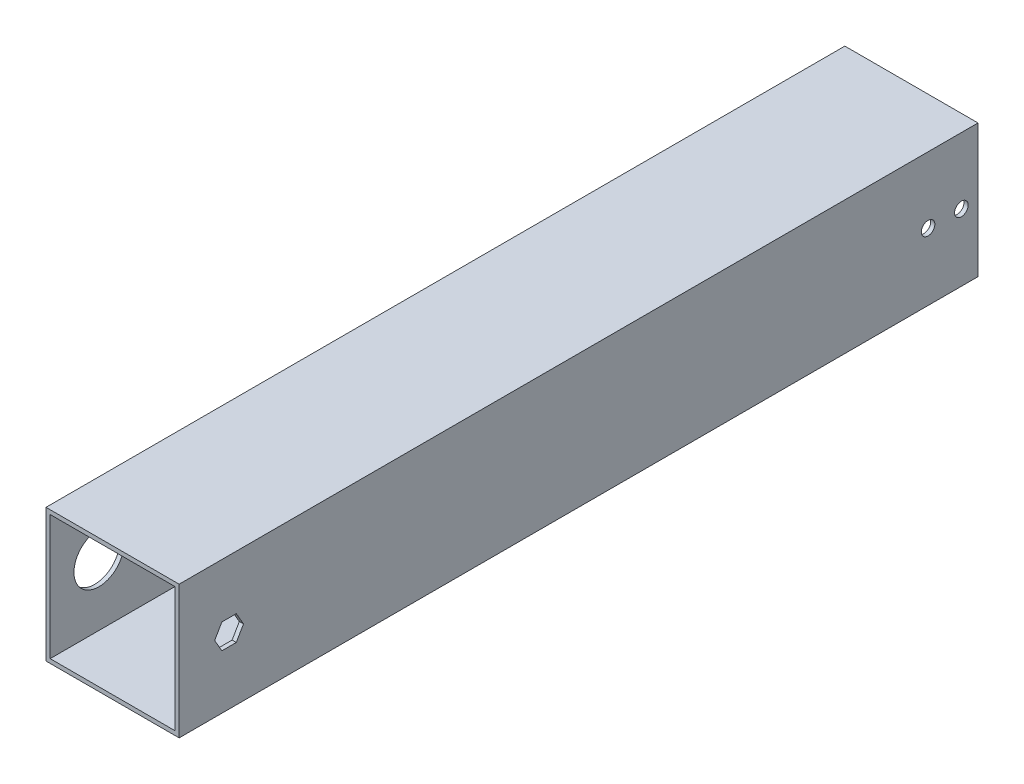
ISO-10303-21;
HEADER;
FILE_DESCRIPTION(('STEP AP214'),'2;1');
FILE_NAME('part.step','',(''),(''),'','','');
FILE_SCHEMA(('AUTOMOTIVE_DESIGN { 1 0 10303 214 1 1 1 1 }'));
ENDSEC;
DATA;
#1=APPLICATION_CONTEXT('core data for automotive mechanical design processes');
#2=APPLICATION_PROTOCOL_DEFINITION('international standard','automotive_design',2000,#1);
#3=PRODUCT_CONTEXT('',#1,'mechanical');
#4=PRODUCT('Part','Part','',(#3));
#5=PRODUCT_RELATED_PRODUCT_CATEGORY('part','',(#4));
#6=PRODUCT_DEFINITION_FORMATION('','',#4);
#7=PRODUCT_DEFINITION_CONTEXT('part definition',#1,'design');
#8=PRODUCT_DEFINITION('design','',#6,#7);
#9=PRODUCT_DEFINITION_SHAPE('','',#8);
#10=(LENGTH_UNIT() NAMED_UNIT(*) SI_UNIT(.MILLI.,.METRE.));
#11=(NAMED_UNIT(*) PLANE_ANGLE_UNIT() SI_UNIT($,.RADIAN.));
#12=(NAMED_UNIT(*) SI_UNIT($,.STERADIAN.) SOLID_ANGLE_UNIT());
#13=UNCERTAINTY_MEASURE_WITH_UNIT(LENGTH_MEASURE(1.E-05),#10,'distance_accuracy_value','');
#14=(GEOMETRIC_REPRESENTATION_CONTEXT(3) GLOBAL_UNCERTAINTY_ASSIGNED_CONTEXT((#13)) GLOBAL_UNIT_ASSIGNED_CONTEXT((#10,
#11,#12)) REPRESENTATION_CONTEXT('',''));
#15=CARTESIAN_POINT('',(0.,0.,0.));
#16=DIRECTION('',(0.,0.,1.));
#17=DIRECTION('',(1.,0.,0.));
#18=AXIS2_PLACEMENT_3D('',#15,#16,#17);
#19=CARTESIAN_POINT('',(0.,0.,304.8));
#20=DIRECTION('',(0.,0.,1.));
#21=DIRECTION('',(1.,0.,0.));
#22=AXIS2_PLACEMENT_3D('',#19,#20,#21);
#23=PLANE('',#22);
#24=DIRECTION('',(0.,-1.,0.));
#25=VECTOR('',#24,1.);
#26=CARTESIAN_POINT('',(-29.3367303609342,25.2382165605095,304.8));
#27=LINE('',#26,#25);
#28=CARTESIAN_POINT('',(-29.3367303609342,25.2382165605095,304.8));
#29=VERTEX_POINT('',#28);
#30=CARTESIAN_POINT('',(-29.3367303609342,-25.5617834394905,304.8));
#31=VERTEX_POINT('',#30);
#32=EDGE_CURVE('E235',#29,#31,#27,.T.);
#33=ORIENTED_EDGE('',*,*,#32,.T.);
#34=DIRECTION('',(1.,0.,0.));
#35=VECTOR('',#34,1.);
#36=CARTESIAN_POINT('',(-29.3367303609342,-25.5617834394905,304.8));
#37=LINE('',#36,#35);
#38=CARTESIAN_POINT('',(21.4632696390658,-25.5617834394905,304.8));
#39=VERTEX_POINT('',#38);
#40=EDGE_CURVE('E239',#31,#39,#37,.T.);
#41=ORIENTED_EDGE('',*,*,#40,.T.);
#42=DIRECTION('',(0.,1.,0.));
#43=VECTOR('',#42,1.);
#44=CARTESIAN_POINT('',(21.4632696390658,25.2382165605095,304.8));
#45=LINE('',#44,#43);
#46=CARTESIAN_POINT('',(21.4632696390658,25.2382165605095,304.8));
#47=VERTEX_POINT('',#46);
#48=EDGE_CURVE('E243',#39,#47,#45,.T.);
#49=ORIENTED_EDGE('',*,*,#48,.T.);
#50=DIRECTION('',(-1.,0.,0.));
#51=VECTOR('',#50,1.);
#52=CARTESIAN_POINT('',(-29.3367303609342,25.2382165605095,304.8));
#53=LINE('',#52,#51);
#54=EDGE_CURVE('E246',#47,#29,#53,.T.);
#55=ORIENTED_EDGE('',*,*,#54,.T.);
#56=EDGE_LOOP('',(#33,#41,#49,#55));
#57=FACE_BOUND('',#56,.T.);
#58=DIRECTION('',(1.,0.,0.));
#59=VECTOR('',#58,1.);
#60=CARTESIAN_POINT('',(-27.7492303609342,-23.9742834394905,304.8));
#61=LINE('',#60,#59);
#62=CARTESIAN_POINT('',(-27.7492303609342,-23.9742834394905,304.8));
#63=VERTEX_POINT('',#62);
#64=CARTESIAN_POINT('',(19.8757696390658,-23.9742834394905,304.8));
#65=VERTEX_POINT('',#64);
#66=EDGE_CURVE('E195',#63,#65,#61,.T.);
#67=ORIENTED_EDGE('',*,*,#66,.F.);
#68=DIRECTION('',(0.,-1.,0.));
#69=VECTOR('',#68,1.);
#70=CARTESIAN_POINT('',(-27.7492303609342,23.6507165605095,304.8));
#71=LINE('',#70,#69);
#72=CARTESIAN_POINT('',(-27.7492303609342,23.6507165605095,304.8));
#73=VERTEX_POINT('',#72);
#74=EDGE_CURVE('E192',#73,#63,#71,.T.);
#75=ORIENTED_EDGE('',*,*,#74,.F.);
#76=DIRECTION('',(-1.,0.,0.));
#77=VECTOR('',#76,1.);
#78=CARTESIAN_POINT('',(-27.7492303609342,23.6507165605095,304.8));
#79=LINE('',#78,#77);
#80=CARTESIAN_POINT('',(19.8757696390658,23.6507165605095,304.8));
#81=VERTEX_POINT('',#80);
#82=EDGE_CURVE('E203',#81,#73,#79,.T.);
#83=ORIENTED_EDGE('',*,*,#82,.F.);
#84=DIRECTION('',(0.,1.,0.));
#85=VECTOR('',#84,1.);
#86=CARTESIAN_POINT('',(19.8757696390658,23.6507165605095,304.8));
#87=LINE('',#86,#85);
#88=EDGE_CURVE('E199',#65,#81,#87,.T.);
#89=ORIENTED_EDGE('',*,*,#88,.F.);
#90=EDGE_LOOP('',(#67,#75,#83,#89));
#91=FACE_BOUND('',#90,.T.);
#92=ADVANCED_FACE('F38',(#57,#91),#23,.T.);
#93=CARTESIAN_POINT('',(0.,0.,0.));
#94=DIRECTION('',(0.,0.,1.));
#95=DIRECTION('',(1.,0.,0.));
#96=AXIS2_PLACEMENT_3D('',#93,#94,#95);
#97=PLANE('',#96);
#98=DIRECTION('',(0.,-1.,0.));
#99=VECTOR('',#98,1.);
#100=CARTESIAN_POINT('',(-29.3367303609342,25.2382165605095,0.));
#101=LINE('',#100,#99);
#102=CARTESIAN_POINT('',(-29.3367303609342,25.2382165605095,0.));
#103=VERTEX_POINT('',#102);
#104=CARTESIAN_POINT('',(-29.3367303609342,-25.5617834394905,0.));
#105=VERTEX_POINT('',#104);
#106=EDGE_CURVE('E234',#103,#105,#101,.T.);
#107=ORIENTED_EDGE('',*,*,#106,.F.);
#108=DIRECTION('',(-1.,0.,0.));
#109=VECTOR('',#108,1.);
#110=CARTESIAN_POINT('',(-29.3367303609342,25.2382165605095,0.));
#111=LINE('',#110,#109);
#112=CARTESIAN_POINT('',(21.4632696390658,25.2382165605095,0.));
#113=VERTEX_POINT('',#112);
#114=EDGE_CURVE('E240',#113,#103,#111,.T.);
#115=ORIENTED_EDGE('',*,*,#114,.F.);
#116=DIRECTION('',(0.,1.,0.));
#117=VECTOR('',#116,1.);
#118=CARTESIAN_POINT('',(21.4632696390658,25.2382165605095,0.));
#119=LINE('',#118,#117);
#120=CARTESIAN_POINT('',(21.4632696390658,-25.5617834394905,0.));
#121=VERTEX_POINT('',#120);
#122=EDGE_CURVE('E256',#121,#113,#119,.T.);
#123=ORIENTED_EDGE('',*,*,#122,.F.);
#124=DIRECTION('',(1.,0.,0.));
#125=VECTOR('',#124,1.);
#126=CARTESIAN_POINT('',(-29.3367303609342,-25.5617834394905,0.));
#127=LINE('',#126,#125);
#128=EDGE_CURVE('E253',#105,#121,#127,.T.);
#129=ORIENTED_EDGE('',*,*,#128,.F.);
#130=EDGE_LOOP('',(#107,#115,#123,#129));
#131=FACE_BOUND('',#130,.T.);
#132=DIRECTION('',(0.,-1.,0.));
#133=VECTOR('',#132,1.);
#134=CARTESIAN_POINT('',(-27.7492303609342,23.6507165605095,0.));
#135=LINE('',#134,#133);
#136=CARTESIAN_POINT('',(-27.7492303609342,23.6507165605095,0.));
#137=VERTEX_POINT('',#136);
#138=CARTESIAN_POINT('',(-27.7492303609342,-23.9742834394905,0.));
#139=VERTEX_POINT('',#138);
#140=EDGE_CURVE('E181',#137,#139,#135,.T.);
#141=ORIENTED_EDGE('',*,*,#140,.T.);
#142=DIRECTION('',(1.,0.,0.));
#143=VECTOR('',#142,1.);
#144=CARTESIAN_POINT('',(-27.7492303609342,-23.9742834394905,0.));
#145=LINE('',#144,#143);
#146=CARTESIAN_POINT('',(19.8757696390658,-23.9742834394905,0.));
#147=VERTEX_POINT('',#146);
#148=EDGE_CURVE('E210',#139,#147,#145,.T.);
#149=ORIENTED_EDGE('',*,*,#148,.T.);
#150=DIRECTION('',(0.,1.,0.));
#151=VECTOR('',#150,1.);
#152=CARTESIAN_POINT('',(19.8757696390658,23.6507165605095,0.));
#153=LINE('',#152,#151);
#154=CARTESIAN_POINT('',(19.8757696390658,23.6507165605095,0.));
#155=VERTEX_POINT('',#154);
#156=EDGE_CURVE('E214',#147,#155,#153,.T.);
#157=ORIENTED_EDGE('',*,*,#156,.T.);
#158=DIRECTION('',(-1.,0.,0.));
#159=VECTOR('',#158,1.);
#160=CARTESIAN_POINT('',(-27.7492303609342,23.6507165605095,0.));
#161=LINE('',#160,#159);
#162=EDGE_CURVE('E196',#155,#137,#161,.T.);
#163=ORIENTED_EDGE('',*,*,#162,.T.);
#164=EDGE_LOOP('',(#141,#149,#157,#163));
#165=FACE_BOUND('',#164,.T.);
#166=ADVANCED_FACE('F339',(#131,#165),#97,.F.);
#167=CARTESIAN_POINT('',(-29.3367303609342,25.2382165605095,304.8));
#168=DIRECTION('',(1.,0.,0.));
#169=DIRECTION('',(0.,1.,0.));
#170=AXIS2_PLACEMENT_3D('',#167,#168,#169);
#171=PLANE('',#170);
#172=CARTESIAN_POINT('',(-29.3367303609342,0.,286.190661960688));
#173=DIRECTION('',(-1.,0.,0.));
#174=DIRECTION('',(0.,-1.,0.));
#175=AXIS2_PLACEMENT_3D('',#172,#173,#174);
#176=CIRCLE('',#175,9.52500000000002);
#177=CARTESIAN_POINT('',(-29.3367303609342,-9.52500000000002,286.190661960688));
#178=VERTEX_POINT('',#177);
#179=EDGE_CURVE('E438',#178,#178,#176,.T.);
#180=ORIENTED_EDGE('',*,*,#179,.F.);
#181=EDGE_LOOP('',(#180));
#182=FACE_BOUND('',#181,.T.);
#183=CARTESIAN_POINT('',(-29.3367303609342,0.,6.35));
#184=DIRECTION('',(1.,0.,0.));
#185=DIRECTION('',(0.,1.,0.));
#186=AXIS2_PLACEMENT_3D('',#183,#184,#185);
#187=CIRCLE('',#186,2.5796875);
#188=CARTESIAN_POINT('',(-29.3367303609342,2.5796875,6.35));
#189=VERTEX_POINT('',#188);
#190=EDGE_CURVE('E304',#189,#189,#187,.T.);
#191=ORIENTED_EDGE('',*,*,#190,.T.);
#192=EDGE_LOOP('',(#191));
#193=FACE_BOUND('',#192,.T.);
#194=CARTESIAN_POINT('',(-29.3367303609342,0.,19.05));
#195=DIRECTION('',(1.,0.,0.));
#196=DIRECTION('',(0.,1.,0.));
#197=AXIS2_PLACEMENT_3D('',#194,#195,#196);
#198=CIRCLE('',#197,2.5796875);
#199=CARTESIAN_POINT('',(-29.3367303609342,2.5796875,19.05));
#200=VERTEX_POINT('',#199);
#201=EDGE_CURVE('E298',#200,#200,#198,.T.);
#202=ORIENTED_EDGE('',*,*,#201,.T.);
#203=EDGE_LOOP('',(#202));
#204=FACE_BOUND('',#203,.T.);
#205=ORIENTED_EDGE('',*,*,#106,.T.);
#206=DIRECTION('',(0.,0.,-1.));
#207=VECTOR('',#206,1.);
#208=CARTESIAN_POINT('',(-29.3367303609342,-25.5617834394905,304.8));
#209=LINE('',#208,#207);
#210=EDGE_CURVE('E272',#31,#105,#209,.T.);
#211=ORIENTED_EDGE('',*,*,#210,.F.);
#212=ORIENTED_EDGE('',*,*,#32,.F.);
#213=DIRECTION('',(0.,0.,-1.));
#214=VECTOR('',#213,1.);
#215=CARTESIAN_POINT('',(-29.3367303609342,25.2382165605095,304.8));
#216=LINE('',#215,#214);
#217=EDGE_CURVE('E249',#29,#103,#216,.T.);
#218=ORIENTED_EDGE('',*,*,#217,.T.);
#219=EDGE_LOOP('',(#205,#211,#212,#218));
#220=FACE_BOUND('',#219,.T.);
#221=ADVANCED_FACE('F40',(#182,#193,#204,#220),#171,.F.);
#222=CARTESIAN_POINT('',(-29.3367303609342,-25.5617834394905,304.8));
#223=DIRECTION('',(0.,1.,0.));
#224=DIRECTION('',(0.,0.,1.));
#225=AXIS2_PLACEMENT_3D('',#222,#223,#224);
#226=PLANE('',#225);
#227=ORIENTED_EDGE('',*,*,#128,.T.);
#228=DIRECTION('',(0.,0.,-1.));
#229=VECTOR('',#228,1.);
#230=CARTESIAN_POINT('',(21.4632696390658,-25.5617834394905,304.8));
#231=LINE('',#230,#229);
#232=EDGE_CURVE('E268',#39,#121,#231,.T.);
#233=ORIENTED_EDGE('',*,*,#232,.F.);
#234=ORIENTED_EDGE('',*,*,#40,.F.);
#235=ORIENTED_EDGE('',*,*,#210,.T.);
#236=EDGE_LOOP('',(#227,#233,#234,#235));
#237=FACE_BOUND('',#236,.T.);
#238=ADVANCED_FACE('F357',(#237),#226,.F.);
#239=CARTESIAN_POINT('',(21.4632696390658,25.2382165605095,304.8));
#240=DIRECTION('',(-1.,0.,0.));
#241=DIRECTION('',(0.,-1.,0.));
#242=AXIS2_PLACEMENT_3D('',#239,#240,#241);
#243=PLANE('',#242);
#244=CARTESIAN_POINT('',(21.4632696390658,0.,6.35));
#245=DIRECTION('',(1.,0.,0.));
#246=DIRECTION('',(0.,1.,0.));
#247=AXIS2_PLACEMENT_3D('',#244,#245,#246);
#248=CIRCLE('',#247,2.5796875);
#249=CARTESIAN_POINT('',(21.4632696390658,2.5796875,6.35));
#250=VERTEX_POINT('',#249);
#251=EDGE_CURVE('E293',#250,#250,#248,.T.);
#252=ORIENTED_EDGE('',*,*,#251,.F.);
#253=EDGE_LOOP('',(#252));
#254=FACE_BOUND('',#253,.T.);
#255=CARTESIAN_POINT('',(21.4632696390658,0.,19.05));
#256=DIRECTION('',(1.,0.,0.));
#257=DIRECTION('',(0.,1.,0.));
#258=AXIS2_PLACEMENT_3D('',#255,#256,#257);
#259=CIRCLE('',#258,2.5796875);
#260=CARTESIAN_POINT('',(21.4632696390658,2.5796875,19.05));
#261=VERTEX_POINT('',#260);
#262=EDGE_CURVE('E430',#261,#261,#259,.T.);
#263=ORIENTED_EDGE('',*,*,#262,.F.);
#264=EDGE_LOOP('',(#263));
#265=FACE_BOUND('',#264,.T.);
#266=DIRECTION('',(0.,0.866025403784438,0.500000000000001));
#267=VECTOR('',#266,1.);
#268=CARTESIAN_POINT('',(21.4632696390658,-0.161783439490455,280.250738685969));
#269=LINE('',#268,#267);
#270=CARTESIAN_POINT('',(21.4632696390658,-0.161783439490495,280.250738685969));
#271=VERTEX_POINT('',#270);
#272=CARTESIAN_POINT('',(21.4632696390658,4.60071656050956,283.000369342984));
#273=VERTEX_POINT('',#272);
#274=EDGE_CURVE('E154',#271,#273,#269,.T.);
#275=ORIENTED_EDGE('',*,*,#274,.F.);
#276=DIRECTION('',(0.,0.866025403784438,-0.500000000000001));
#277=VECTOR('',#276,1.);
#278=CARTESIAN_POINT('',(21.4632696390658,-4.92428343949047,283.000369342984));
#279=LINE('',#278,#277);
#280=CARTESIAN_POINT('',(21.4632696390658,-4.92428343949047,283.000369342984));
#281=VERTEX_POINT('',#280);
#282=EDGE_CURVE('E56',#281,#271,#279,.T.);
#283=ORIENTED_EDGE('',*,*,#282,.F.);
#284=DIRECTION('',(0.,0.,-1.));
#285=VECTOR('',#284,1.);
#286=CARTESIAN_POINT('',(21.4632696390658,-4.92428343949047,288.499630657016));
#287=LINE('',#286,#285);
#288=CARTESIAN_POINT('',(21.4632696390658,-4.92428343949047,288.499630657016));
#289=VERTEX_POINT('',#288);
#290=EDGE_CURVE('E174',#289,#281,#287,.T.);
#291=ORIENTED_EDGE('',*,*,#290,.F.);
#292=DIRECTION('',(0.,-0.866025403784439,-0.5));
#293=VECTOR('',#292,1.);
#294=CARTESIAN_POINT('',(21.4632696390658,-0.161783439490436,291.249261314031));
#295=LINE('',#294,#293);
#296=CARTESIAN_POINT('',(21.4632696390658,-0.161783439490436,291.249261314031));
#297=VERTEX_POINT('',#296);
#298=EDGE_CURVE('E167',#297,#289,#295,.T.);
#299=ORIENTED_EDGE('',*,*,#298,.F.);
#300=DIRECTION('',(0.,-0.866025403784437,0.500000000000003));
#301=VECTOR('',#300,1.);
#302=CARTESIAN_POINT('',(21.4632696390658,4.60071656050956,288.499630657016));
#303=LINE('',#302,#301);
#304=CARTESIAN_POINT('',(21.4632696390658,4.60071656050956,288.499630657016));
#305=VERTEX_POINT('',#304);
#306=EDGE_CURVE('E163',#305,#297,#303,.T.);
#307=ORIENTED_EDGE('',*,*,#306,.F.);
#308=DIRECTION('',(0.,0.,1.));
#309=VECTOR('',#308,1.);
#310=CARTESIAN_POINT('',(21.4632696390658,4.60071656050956,283.000369342984));
#311=LINE('',#310,#309);
#312=EDGE_CURVE('E144',#273,#305,#311,.T.);
#313=ORIENTED_EDGE('',*,*,#312,.F.);
#314=EDGE_LOOP('',(#275,#283,#291,#299,#307,#313));
#315=FACE_BOUND('',#314,.T.);
#316=ORIENTED_EDGE('',*,*,#122,.T.);
#317=DIRECTION('',(0.,0.,-1.));
#318=VECTOR('',#317,1.);
#319=CARTESIAN_POINT('',(21.4632696390658,25.2382165605095,304.8));
#320=LINE('',#319,#318);
#321=EDGE_CURVE('E264',#47,#113,#320,.T.);
#322=ORIENTED_EDGE('',*,*,#321,.F.);
#323=ORIENTED_EDGE('',*,*,#48,.F.);
#324=ORIENTED_EDGE('',*,*,#232,.T.);
#325=EDGE_LOOP('',(#316,#322,#323,#324));
#326=FACE_BOUND('',#325,.T.);
#327=ADVANCED_FACE('F159',(#254,#265,#315,#326),#243,.F.);
#328=CARTESIAN_POINT('',(-29.3367303609342,25.2382165605095,304.8));
#329=DIRECTION('',(0.,-1.,0.));
#330=DIRECTION('',(0.,0.,-1.));
#331=AXIS2_PLACEMENT_3D('',#328,#329,#330);
#332=PLANE('',#331);
#333=ORIENTED_EDGE('',*,*,#114,.T.);
#334=ORIENTED_EDGE('',*,*,#217,.F.);
#335=ORIENTED_EDGE('',*,*,#54,.F.);
#336=ORIENTED_EDGE('',*,*,#321,.T.);
#337=EDGE_LOOP('',(#333,#334,#335,#336));
#338=FACE_BOUND('',#337,.T.);
#339=ADVANCED_FACE('F352',(#338),#332,.F.);
#340=CARTESIAN_POINT('',(-27.7492303609342,23.6507165605095,304.8));
#341=DIRECTION('',(1.,0.,0.));
#342=DIRECTION('',(0.,1.,0.));
#343=AXIS2_PLACEMENT_3D('',#340,#341,#342);
#344=PLANE('',#343);
#345=CARTESIAN_POINT('',(-27.7492303609342,0.,286.190661960688));
#346=DIRECTION('',(1.,0.,0.));
#347=DIRECTION('',(0.,1.,0.));
#348=AXIS2_PLACEMENT_3D('',#345,#346,#347);
#349=CIRCLE('',#348,9.52500000000002);
#350=CARTESIAN_POINT('',(-27.7492303609342,9.52500000000002,286.190661960688));
#351=VERTEX_POINT('',#350);
#352=EDGE_CURVE('E42',#351,#351,#349,.T.);
#353=ORIENTED_EDGE('',*,*,#352,.F.);
#354=EDGE_LOOP('',(#353));
#355=FACE_BOUND('',#354,.T.);
#356=CARTESIAN_POINT('',(-27.7492303609342,0.,6.35));
#357=DIRECTION('',(1.,0.,0.));
#358=DIRECTION('',(0.,1.,0.));
#359=AXIS2_PLACEMENT_3D('',#356,#357,#358);
#360=CIRCLE('',#359,2.5796875);
#361=CARTESIAN_POINT('',(-27.7492303609342,2.5796875,6.35));
#362=VERTEX_POINT('',#361);
#363=EDGE_CURVE('E297',#362,#362,#360,.T.);
#364=ORIENTED_EDGE('',*,*,#363,.F.);
#365=EDGE_LOOP('',(#364));
#366=FACE_BOUND('',#365,.T.);
#367=CARTESIAN_POINT('',(-27.7492303609342,0.,19.05));
#368=DIRECTION('',(1.,0.,0.));
#369=DIRECTION('',(0.,1.,0.));
#370=AXIS2_PLACEMENT_3D('',#367,#368,#369);
#371=CIRCLE('',#370,2.5796875);
#372=CARTESIAN_POINT('',(-27.7492303609342,2.5796875,19.05));
#373=VERTEX_POINT('',#372);
#374=EDGE_CURVE('E292',#373,#373,#371,.T.);
#375=ORIENTED_EDGE('',*,*,#374,.F.);
#376=EDGE_LOOP('',(#375));
#377=FACE_BOUND('',#376,.T.);
#378=ORIENTED_EDGE('',*,*,#140,.F.);
#379=DIRECTION('',(0.,0.,-1.));
#380=VECTOR('',#379,1.);
#381=CARTESIAN_POINT('',(-27.7492303609342,23.6507165605095,304.8));
#382=LINE('',#381,#380);
#383=EDGE_CURVE('E206',#73,#137,#382,.T.);
#384=ORIENTED_EDGE('',*,*,#383,.F.);
#385=ORIENTED_EDGE('',*,*,#74,.T.);
#386=DIRECTION('',(0.,0.,-1.));
#387=VECTOR('',#386,1.);
#388=CARTESIAN_POINT('',(-27.7492303609342,-23.9742834394905,304.8));
#389=LINE('',#388,#387);
#390=EDGE_CURVE('E230',#63,#139,#389,.T.);
#391=ORIENTED_EDGE('',*,*,#390,.T.);
#392=EDGE_LOOP('',(#378,#384,#385,#391));
#393=FACE_BOUND('',#392,.T.);
#394=ADVANCED_FACE('F349',(#355,#366,#377,#393),#344,.T.);
#395=CARTESIAN_POINT('',(-27.7492303609342,-23.9742834394905,304.8));
#396=DIRECTION('',(0.,1.,0.));
#397=DIRECTION('',(0.,0.,1.));
#398=AXIS2_PLACEMENT_3D('',#395,#396,#397);
#399=PLANE('',#398);
#400=ORIENTED_EDGE('',*,*,#148,.F.);
#401=ORIENTED_EDGE('',*,*,#390,.F.);
#402=ORIENTED_EDGE('',*,*,#66,.T.);
#403=DIRECTION('',(0.,0.,-1.));
#404=VECTOR('',#403,1.);
#405=CARTESIAN_POINT('',(19.8757696390658,-23.9742834394905,304.8));
#406=LINE('',#405,#404);
#407=EDGE_CURVE('E227',#65,#147,#406,.T.);
#408=ORIENTED_EDGE('',*,*,#407,.T.);
#409=EDGE_LOOP('',(#400,#401,#402,#408));
#410=FACE_BOUND('',#409,.T.);
#411=ADVANCED_FACE('F389',(#410),#399,.T.);
#412=CARTESIAN_POINT('',(19.8757696390658,23.6507165605095,304.8));
#413=DIRECTION('',(-1.,0.,0.));
#414=DIRECTION('',(0.,-1.,0.));
#415=AXIS2_PLACEMENT_3D('',#412,#413,#414);
#416=PLANE('',#415);
#417=CARTESIAN_POINT('',(19.8757696390658,0.,6.35));
#418=DIRECTION('',(-1.,0.,0.));
#419=DIRECTION('',(0.,-1.,0.));
#420=AXIS2_PLACEMENT_3D('',#417,#418,#419);
#421=CIRCLE('',#420,2.5796875);
#422=CARTESIAN_POINT('',(19.8757696390658,2.5796875,6.35));
#423=VERTEX_POINT('',#422);
#424=EDGE_CURVE('E294',#423,#423,#421,.T.);
#425=ORIENTED_EDGE('',*,*,#424,.F.);
#426=EDGE_LOOP('',(#425));
#427=FACE_BOUND('',#426,.T.);
#428=CARTESIAN_POINT('',(19.8757696390658,0.,19.05));
#429=DIRECTION('',(-1.,0.,0.));
#430=DIRECTION('',(0.,-1.,0.));
#431=AXIS2_PLACEMENT_3D('',#428,#429,#430);
#432=CIRCLE('',#431,2.5796875);
#433=CARTESIAN_POINT('',(19.8757696390658,2.5796875,19.05));
#434=VERTEX_POINT('',#433);
#435=EDGE_CURVE('E289',#434,#434,#432,.T.);
#436=ORIENTED_EDGE('',*,*,#435,.F.);
#437=EDGE_LOOP('',(#436));
#438=FACE_BOUND('',#437,.T.);
#439=DIRECTION('',(0.,-0.866025403784438,0.500000000000001));
#440=VECTOR('',#439,1.);
#441=CARTESIAN_POINT('',(19.8757696390658,7.0674495894627,276.076939050668));
#442=LINE('',#441,#440);
#443=CARTESIAN_POINT('',(19.8757696390657,-0.161783439490455,280.250738685969));
#444=VERTEX_POINT('',#443);
#445=CARTESIAN_POINT('',(19.8757696390657,-4.92428343949047,283.000369342984));
#446=VERTEX_POINT('',#445);
#447=EDGE_CURVE('E11',#444,#446,#442,.T.);
#448=ORIENTED_EDGE('',*,*,#447,.F.);
#449=DIRECTION('',(0.,-0.866025403784438,-0.500000000000001));
#450=VECTOR('',#449,1.);
#451=CARTESIAN_POINT('',(19.8757696390658,28.3277335315563,296.699168978285));
#452=LINE('',#451,#450);
#453=CARTESIAN_POINT('',(19.8757696390658,4.60071656050956,283.000369342984));
#454=VERTEX_POINT('',#453);
#455=EDGE_CURVE('E276',#454,#444,#452,.T.);
#456=ORIENTED_EDGE('',*,*,#455,.F.);
#457=DIRECTION('',(0.,0.,-1.));
#458=VECTOR('',#457,1.);
#459=CARTESIAN_POINT('',(19.8757696390658,4.60071656050956,304.8));
#460=LINE('',#459,#458);
#461=CARTESIAN_POINT('',(19.8757696390657,4.60071656050956,288.499630657016));
#462=VERTEX_POINT('',#461);
#463=EDGE_CURVE('E147',#462,#454,#460,.T.);
#464=ORIENTED_EDGE('',*,*,#463,.F.);
#465=DIRECTION('',(0.,0.866025403784437,-0.500000000000003));
#466=VECTOR('',#465,1.);
#467=CARTESIAN_POINT('',(19.8757696390658,11.8299495894627,284.325831021715));
#468=LINE('',#467,#466);
#469=CARTESIAN_POINT('',(19.8757696390657,-0.161783439490437,291.249261314031));
#470=VERTEX_POINT('',#469);
#471=EDGE_CURVE('E281',#470,#462,#468,.T.);
#472=ORIENTED_EDGE('',*,*,#471,.F.);
#473=DIRECTION('',(0.,0.866025403784439,0.5));
#474=VECTOR('',#473,1.);
#475=CARTESIAN_POINT('',(19.8757696390658,23.5652335315563,304.948060949332));
#476=LINE('',#475,#474);
#477=CARTESIAN_POINT('',(19.8757696390657,-4.92428343949047,288.499630657016));
#478=VERTEX_POINT('',#477);
#479=EDGE_CURVE('E284',#478,#470,#476,.T.);
#480=ORIENTED_EDGE('',*,*,#479,.F.);
#481=DIRECTION('',(0.,0.,1.));
#482=VECTOR('',#481,1.);
#483=CARTESIAN_POINT('',(19.8757696390658,-4.92428343949047,304.8));
#484=LINE('',#483,#482);
#485=EDGE_CURVE('E48',#446,#478,#484,.T.);
#486=ORIENTED_EDGE('',*,*,#485,.F.);
#487=EDGE_LOOP('',(#448,#456,#464,#472,#480,#486));
#488=FACE_BOUND('',#487,.T.);
#489=ORIENTED_EDGE('',*,*,#156,.F.);
#490=ORIENTED_EDGE('',*,*,#407,.F.);
#491=ORIENTED_EDGE('',*,*,#88,.T.);
#492=DIRECTION('',(0.,0.,-1.));
#493=VECTOR('',#492,1.);
#494=CARTESIAN_POINT('',(19.8757696390658,23.6507165605095,304.8));
#495=LINE('',#494,#493);
#496=EDGE_CURVE('E224',#81,#155,#495,.T.);
#497=ORIENTED_EDGE('',*,*,#496,.T.);
#498=EDGE_LOOP('',(#489,#490,#491,#497));
#499=FACE_BOUND('',#498,.T.);
#500=ADVANCED_FACE('F393',(#427,#438,#488,#499),#416,.T.);
#501=CARTESIAN_POINT('',(-27.7492303609342,23.6507165605095,304.8));
#502=DIRECTION('',(0.,-1.,0.));
#503=DIRECTION('',(0.,0.,-1.));
#504=AXIS2_PLACEMENT_3D('',#501,#502,#503);
#505=PLANE('',#504);
#506=ORIENTED_EDGE('',*,*,#162,.F.);
#507=ORIENTED_EDGE('',*,*,#496,.F.);
#508=ORIENTED_EDGE('',*,*,#82,.T.);
#509=ORIENTED_EDGE('',*,*,#383,.T.);
#510=EDGE_LOOP('',(#506,#507,#508,#509));
#511=FACE_BOUND('',#510,.T.);
#512=ADVANCED_FACE('F384',(#511),#505,.T.);
#513=CARTESIAN_POINT('',(-283.336730360934,-0.161783439490496,280.250738685969));
#514=DIRECTION('',(0.,0.500000000000001,-0.866025403784438));
#515=DIRECTION('',(0.,0.866025403784438,0.500000000000001));
#516=AXIS2_PLACEMENT_3D('',#513,#514,#515);
#517=PLANE('',#516);
#518=ORIENTED_EDGE('',*,*,#455,.T.);
#519=DIRECTION('',(1.,0.,0.));
#520=VECTOR('',#519,1.);
#521=CARTESIAN_POINT('',(-283.336730360934,-0.161783439490496,280.250738685969));
#522=LINE('',#521,#520);
#523=EDGE_CURVE('E151',#444,#271,#522,.T.);
#524=ORIENTED_EDGE('',*,*,#523,.T.);
#525=ORIENTED_EDGE('',*,*,#274,.T.);
#526=DIRECTION('',(1.,0.,0.));
#527=VECTOR('',#526,1.);
#528=CARTESIAN_POINT('',(-283.336730360934,4.60071656050952,283.000369342984));
#529=LINE('',#528,#527);
#530=EDGE_CURVE('E64',#454,#273,#529,.T.);
#531=ORIENTED_EDGE('',*,*,#530,.F.);
#532=EDGE_LOOP('',(#518,#524,#525,#531));
#533=FACE_BOUND('',#532,.T.);
#534=ADVANCED_FACE('F155',(#533),#517,.F.);
#535=CARTESIAN_POINT('',(-283.336730360934,4.60071656050952,283.000369342984));
#536=DIRECTION('',(0.,1.,0.));
#537=DIRECTION('',(-1.,0.,0.));
#538=AXIS2_PLACEMENT_3D('',#535,#536,#537);
#539=PLANE('',#538);
#540=ORIENTED_EDGE('',*,*,#463,.T.);
#541=ORIENTED_EDGE('',*,*,#530,.T.);
#542=ORIENTED_EDGE('',*,*,#312,.T.);
#543=DIRECTION('',(1.,0.,0.));
#544=VECTOR('',#543,1.);
#545=CARTESIAN_POINT('',(-283.336730360934,4.60071656050952,288.499630657016));
#546=LINE('',#545,#544);
#547=EDGE_CURVE('E150',#462,#305,#546,.T.);
#548=ORIENTED_EDGE('',*,*,#547,.F.);
#549=EDGE_LOOP('',(#540,#541,#542,#548));
#550=FACE_BOUND('',#549,.T.);
#551=ADVANCED_FACE('F141',(#550),#539,.F.);
#552=CARTESIAN_POINT('',(-283.336730360934,4.60071656050952,288.499630657016));
#553=DIRECTION('',(0.,0.500000000000003,0.866025403784437));
#554=DIRECTION('',(0.,-0.866025403784437,0.500000000000003));
#555=AXIS2_PLACEMENT_3D('',#552,#553,#554);
#556=PLANE('',#555);
#557=ORIENTED_EDGE('',*,*,#471,.T.);
#558=ORIENTED_EDGE('',*,*,#547,.T.);
#559=ORIENTED_EDGE('',*,*,#306,.T.);
#560=DIRECTION('',(1.,0.,0.));
#561=VECTOR('',#560,1.);
#562=CARTESIAN_POINT('',(-283.336730360934,-0.161783439490478,291.249261314031));
#563=LINE('',#562,#561);
#564=EDGE_CURVE('E185',#470,#297,#563,.T.);
#565=ORIENTED_EDGE('',*,*,#564,.F.);
#566=EDGE_LOOP('',(#557,#558,#559,#565));
#567=FACE_BOUND('',#566,.T.);
#568=ADVANCED_FACE('F412',(#567),#556,.F.);
#569=CARTESIAN_POINT('',(-283.336730360934,-0.161783439490478,291.249261314031));
#570=DIRECTION('',(0.,-0.5,0.866025403784439));
#571=DIRECTION('',(0.,-0.866025403784439,-0.5));
#572=AXIS2_PLACEMENT_3D('',#569,#570,#571);
#573=PLANE('',#572);
#574=ORIENTED_EDGE('',*,*,#479,.T.);
#575=ORIENTED_EDGE('',*,*,#564,.T.);
#576=ORIENTED_EDGE('',*,*,#298,.T.);
#577=DIRECTION('',(1.,0.,0.));
#578=VECTOR('',#577,1.);
#579=CARTESIAN_POINT('',(-283.336730360934,-4.92428343949051,288.499630657016));
#580=LINE('',#579,#578);
#581=EDGE_CURVE('E182',#478,#289,#580,.T.);
#582=ORIENTED_EDGE('',*,*,#581,.F.);
#583=EDGE_LOOP('',(#574,#575,#576,#582));
#584=FACE_BOUND('',#583,.T.);
#585=ADVANCED_FACE('F415',(#584),#573,.F.);
#586=CARTESIAN_POINT('',(-283.336730360934,-4.92428343949051,288.499630657016));
#587=DIRECTION('',(0.,-1.,0.));
#588=DIRECTION('',(0.,0.,-1.));
#589=AXIS2_PLACEMENT_3D('',#586,#587,#588);
#590=PLANE('',#589);
#591=ORIENTED_EDGE('',*,*,#485,.T.);
#592=ORIENTED_EDGE('',*,*,#581,.T.);
#593=ORIENTED_EDGE('',*,*,#290,.T.);
#594=DIRECTION('',(1.,0.,0.));
#595=VECTOR('',#594,1.);
#596=CARTESIAN_POINT('',(-283.336730360934,-4.92428343949051,283.000369342984));
#597=LINE('',#596,#595);
#598=EDGE_CURVE('E178',#446,#281,#597,.T.);
#599=ORIENTED_EDGE('',*,*,#598,.F.);
#600=EDGE_LOOP('',(#591,#592,#593,#599));
#601=FACE_BOUND('',#600,.T.);
#602=ADVANCED_FACE('F407',(#601),#590,.F.);
#603=CARTESIAN_POINT('',(-283.336730360934,-4.92428343949051,283.000369342984));
#604=DIRECTION('',(0.,-0.500000000000001,-0.866025403784438));
#605=DIRECTION('',(0.,0.866025403784438,-0.500000000000001));
#606=AXIS2_PLACEMENT_3D('',#603,#604,#605);
#607=PLANE('',#606);
#608=ORIENTED_EDGE('',*,*,#447,.T.);
#609=ORIENTED_EDGE('',*,*,#598,.T.);
#610=ORIENTED_EDGE('',*,*,#282,.T.);
#611=ORIENTED_EDGE('',*,*,#523,.F.);
#612=EDGE_LOOP('',(#608,#609,#610,#611));
#613=FACE_BOUND('',#612,.T.);
#614=ADVANCED_FACE('F404',(#613),#607,.F.);
#615=CARTESIAN_POINT('',(-137.536730360934,0.,19.05));
#616=DIRECTION('',(1.,0.,0.));
#617=DIRECTION('',(0.,1.,0.));
#618=AXIS2_PLACEMENT_3D('',#615,#616,#617);
#619=CYLINDRICAL_SURFACE('',#618,2.5796875);
#620=CARTESIAN_POINT('',(19.8757696390658,2.5796875,19.05));
#621=CARTESIAN_POINT('',(19.8923060973991,2.5796875,19.05));
#622=CARTESIAN_POINT('',(19.9088425557324,2.5796875,19.05));
#623=CARTESIAN_POINT('',(19.9419154723991,2.5796875,19.05));
#624=CARTESIAN_POINT('',(19.9584519307324,2.5796875,19.05));
#625=CARTESIAN_POINT('',(19.9915248473991,2.5796875,19.05));
#626=CARTESIAN_POINT('',(20.0080613057324,2.5796875,19.05));
#627=CARTESIAN_POINT('',(20.0411342223991,2.5796875,19.05));
#628=CARTESIAN_POINT('',(20.0576706807324,2.5796875,19.05));
#629=CARTESIAN_POINT('',(20.0907435973991,2.5796875,19.05));
#630=CARTESIAN_POINT('',(20.1072800557324,2.5796875,19.05));
#631=CARTESIAN_POINT('',(20.1403529723991,2.5796875,19.05));
#632=CARTESIAN_POINT('',(20.1568894307324,2.5796875,19.05));
#633=CARTESIAN_POINT('',(20.1899623473991,2.5796875,19.05));
#634=CARTESIAN_POINT('',(20.2064988057324,2.5796875,19.05));
#635=CARTESIAN_POINT('',(20.2395717223991,2.5796875,19.05));
#636=CARTESIAN_POINT('',(20.2561081807324,2.5796875,19.05));
#637=CARTESIAN_POINT('',(20.2891810973991,2.5796875,19.05));
#638=CARTESIAN_POINT('',(20.3057175557324,2.5796875,19.05));
#639=CARTESIAN_POINT('',(20.3387904723991,2.5796875,19.05));
#640=CARTESIAN_POINT('',(20.3553269307325,2.5796875,19.05));
#641=CARTESIAN_POINT('',(20.3883998473991,2.5796875,19.05));
#642=CARTESIAN_POINT('',(20.4049363057325,2.5796875,19.05));
#643=CARTESIAN_POINT('',(20.4380092223991,2.5796875,19.05));
#644=CARTESIAN_POINT('',(20.4545456807325,2.5796875,19.05));
#645=CARTESIAN_POINT('',(20.4876185973991,2.5796875,19.05));
#646=CARTESIAN_POINT('',(20.5041550557325,2.5796875,19.05));
#647=CARTESIAN_POINT('',(20.5372279723991,2.5796875,19.05));
#648=CARTESIAN_POINT('',(20.5537644307325,2.5796875,19.05));
#649=CARTESIAN_POINT('',(20.5868373473991,2.5796875,19.05));
#650=CARTESIAN_POINT('',(20.6033738057324,2.5796875,19.05));
#651=CARTESIAN_POINT('',(20.6364467223991,2.5796875,19.05));
#652=CARTESIAN_POINT('',(20.6529831807325,2.5796875,19.05));
#653=CARTESIAN_POINT('',(20.6860560973991,2.5796875,19.05));
#654=CARTESIAN_POINT('',(20.7025925557325,2.5796875,19.05));
#655=CARTESIAN_POINT('',(20.7356654723991,2.5796875,19.05));
#656=CARTESIAN_POINT('',(20.7522019307325,2.5796875,19.05));
#657=CARTESIAN_POINT('',(20.7852748473991,2.5796875,19.05));
#658=CARTESIAN_POINT('',(20.8018113057325,2.5796875,19.05));
#659=CARTESIAN_POINT('',(20.8348842223991,2.5796875,19.05));
#660=CARTESIAN_POINT('',(20.8514206807325,2.5796875,19.05));
#661=CARTESIAN_POINT('',(20.8844935973991,2.5796875,19.05));
#662=CARTESIAN_POINT('',(20.9010300557325,2.5796875,19.05));
#663=CARTESIAN_POINT('',(20.9341029723991,2.5796875,19.05));
#664=CARTESIAN_POINT('',(20.9506394307325,2.5796875,19.05));
#665=CARTESIAN_POINT('',(20.9837123473991,2.5796875,19.05));
#666=CARTESIAN_POINT('',(21.0002488057325,2.5796875,19.05));
#667=CARTESIAN_POINT('',(21.0333217223991,2.5796875,19.05));
#668=CARTESIAN_POINT('',(21.0498581807325,2.5796875,19.05));
#669=CARTESIAN_POINT('',(21.0829310973992,2.5796875,19.05));
#670=CARTESIAN_POINT('',(21.0994675557325,2.5796875,19.05));
#671=CARTESIAN_POINT('',(21.1325404723992,2.5796875,19.05));
#672=CARTESIAN_POINT('',(21.1490769307325,2.5796875,19.05));
#673=CARTESIAN_POINT('',(21.1821498473992,2.5796875,19.05));
#674=CARTESIAN_POINT('',(21.1986863057325,2.5796875,19.05));
#675=CARTESIAN_POINT('',(21.2317592223992,2.5796875,19.05));
#676=CARTESIAN_POINT('',(21.2482956807325,2.5796875,19.05));
#677=CARTESIAN_POINT('',(21.2813685973992,2.5796875,19.05));
#678=CARTESIAN_POINT('',(21.2979050557325,2.5796875,19.05));
#679=CARTESIAN_POINT('',(21.3309779723992,2.5796875,19.05));
#680=CARTESIAN_POINT('',(21.3475144307325,2.5796875,19.05));
#681=CARTESIAN_POINT('',(21.3805873473992,2.5796875,19.05));
#682=CARTESIAN_POINT('',(21.3971238057325,2.5796875,19.05));
#683=CARTESIAN_POINT('',(21.4301967223992,2.5796875,19.05));
#684=CARTESIAN_POINT('',(21.4467331807325,2.5796875,19.05));
#685=CARTESIAN_POINT('',(21.4632696390658,2.5796875,19.05));
#686=B_SPLINE_CURVE_WITH_KNOTS('',3,(#620,#621,#622,#623,#624,#625,#626,#627,#628,#629,#630,
#631,#632,#633,#634,#635,#636,#637,#638,#639,#640,#641,#642,#643,#644,#645,#646,#647,#648,#649,
#650,#651,#652,#653,#654,#655,#656,#657,#658,#659,#660,#661,#662,#663,#664,#665,#666,#667,#668,
#669,#670,#671,#672,#673,#674,#675,#676,#677,#678,#679,#680,#681,#682,#683,#684,#685),
.UNSPECIFIED.,.F.,.F.,(4,2,2,2,2,2,2,2,2,2,2,2,2,2,2,2,2,2,2,2,2,2,2,2,2,2,2,2,2,2,2,2,4),(0.,
0.0496093750000093,0.0992187500000186,0.148828125,0.198437500000009,0.248046875000019,
0.29765625,0.347265625000009,0.396875000000019,0.446484375000028,0.496093750000037,
0.545703125000019,0.595312500000028,0.644921875000037,0.694531250000019,0.744140625000028,
0.793750000000037,0.843359375000047,0.892968750000056,0.942578125000038,0.992187500000047,
1.04179687500006,1.09140625000004,1.14101562500005,1.19062500000006,1.24023437500007,
1.28984375000007,1.33945312500006,1.38906250000007,1.43867187500007,1.48828125000006,
1.53789062500007,1.58750000000007),.UNSPECIFIED.);
#687=EDGE_CURVE('BSEAM336',#434,#261,#686,.T.);
#688=ORIENTED_EDGE('',*,*,#435,.T.);
#689=ORIENTED_EDGE('',*,*,#262,.T.);
#690=ORIENTED_EDGE('',*,*,#687,.T.);
#691=ORIENTED_EDGE('',*,*,#687,.F.);
#692=EDGE_LOOP('',(#688,#690,#689,#691));
#693=FACE_BOUND('',#692,.T.);
#694=ADVANCED_FACE('F336',(#693),#619,.F.);
#695=CARTESIAN_POINT('',(-137.536730360934,0.,6.35));
#696=DIRECTION('',(1.,0.,0.));
#697=DIRECTION('',(0.,1.,0.));
#698=AXIS2_PLACEMENT_3D('',#695,#696,#697);
#699=CYLINDRICAL_SURFACE('',#698,2.5796875);
#700=CARTESIAN_POINT('',(19.8757696390658,2.5796875,6.35));
#701=CARTESIAN_POINT('',(19.8923060973991,2.5796875,6.35));
#702=CARTESIAN_POINT('',(19.9088425557324,2.5796875,6.35));
#703=CARTESIAN_POINT('',(19.9419154723991,2.5796875,6.35));
#704=CARTESIAN_POINT('',(19.9584519307324,2.5796875,6.35));
#705=CARTESIAN_POINT('',(19.9915248473991,2.5796875,6.35));
#706=CARTESIAN_POINT('',(20.0080613057324,2.5796875,6.35));
#707=CARTESIAN_POINT('',(20.0411342223991,2.5796875,6.35));
#708=CARTESIAN_POINT('',(20.0576706807324,2.5796875,6.35));
#709=CARTESIAN_POINT('',(20.0907435973991,2.5796875,6.35));
#710=CARTESIAN_POINT('',(20.1072800557324,2.5796875,6.35));
#711=CARTESIAN_POINT('',(20.1403529723991,2.5796875,6.35));
#712=CARTESIAN_POINT('',(20.1568894307324,2.5796875,6.35));
#713=CARTESIAN_POINT('',(20.1899623473991,2.5796875,6.35));
#714=CARTESIAN_POINT('',(20.2064988057324,2.5796875,6.35));
#715=CARTESIAN_POINT('',(20.2395717223991,2.5796875,6.35));
#716=CARTESIAN_POINT('',(20.2561081807324,2.5796875,6.35));
#717=CARTESIAN_POINT('',(20.2891810973991,2.5796875,6.35));
#718=CARTESIAN_POINT('',(20.3057175557324,2.5796875,6.35));
#719=CARTESIAN_POINT('',(20.3387904723991,2.5796875,6.35));
#720=CARTESIAN_POINT('',(20.3553269307325,2.5796875,6.35));
#721=CARTESIAN_POINT('',(20.3883998473991,2.5796875,6.35));
#722=CARTESIAN_POINT('',(20.4049363057325,2.5796875,6.35));
#723=CARTESIAN_POINT('',(20.4380092223991,2.5796875,6.35));
#724=CARTESIAN_POINT('',(20.4545456807325,2.5796875,6.35));
#725=CARTESIAN_POINT('',(20.4876185973991,2.5796875,6.35));
#726=CARTESIAN_POINT('',(20.5041550557325,2.5796875,6.35));
#727=CARTESIAN_POINT('',(20.5372279723991,2.5796875,6.35));
#728=CARTESIAN_POINT('',(20.5537644307325,2.5796875,6.35));
#729=CARTESIAN_POINT('',(20.5868373473991,2.5796875,6.35));
#730=CARTESIAN_POINT('',(20.6033738057324,2.5796875,6.35));
#731=CARTESIAN_POINT('',(20.6364467223991,2.5796875,6.35));
#732=CARTESIAN_POINT('',(20.6529831807325,2.5796875,6.35));
#733=CARTESIAN_POINT('',(20.6860560973991,2.5796875,6.35));
#734=CARTESIAN_POINT('',(20.7025925557325,2.5796875,6.35));
#735=CARTESIAN_POINT('',(20.7356654723991,2.5796875,6.35));
#736=CARTESIAN_POINT('',(20.7522019307325,2.5796875,6.35));
#737=CARTESIAN_POINT('',(20.7852748473991,2.5796875,6.35));
#738=CARTESIAN_POINT('',(20.8018113057325,2.5796875,6.35));
#739=CARTESIAN_POINT('',(20.8348842223991,2.5796875,6.35));
#740=CARTESIAN_POINT('',(20.8514206807325,2.5796875,6.35));
#741=CARTESIAN_POINT('',(20.8844935973991,2.5796875,6.35));
#742=CARTESIAN_POINT('',(20.9010300557325,2.5796875,6.35));
#743=CARTESIAN_POINT('',(20.9341029723991,2.5796875,6.35));
#744=CARTESIAN_POINT('',(20.9506394307325,2.5796875,6.35));
#745=CARTESIAN_POINT('',(20.9837123473991,2.5796875,6.35));
#746=CARTESIAN_POINT('',(21.0002488057325,2.5796875,6.35));
#747=CARTESIAN_POINT('',(21.0333217223991,2.5796875,6.35));
#748=CARTESIAN_POINT('',(21.0498581807325,2.5796875,6.35));
#749=CARTESIAN_POINT('',(21.0829310973992,2.5796875,6.35));
#750=CARTESIAN_POINT('',(21.0994675557325,2.5796875,6.35));
#751=CARTESIAN_POINT('',(21.1325404723992,2.5796875,6.35));
#752=CARTESIAN_POINT('',(21.1490769307325,2.5796875,6.35));
#753=CARTESIAN_POINT('',(21.1821498473992,2.5796875,6.35));
#754=CARTESIAN_POINT('',(21.1986863057325,2.5796875,6.35));
#755=CARTESIAN_POINT('',(21.2317592223992,2.5796875,6.35));
#756=CARTESIAN_POINT('',(21.2482956807325,2.5796875,6.35));
#757=CARTESIAN_POINT('',(21.2813685973992,2.5796875,6.35));
#758=CARTESIAN_POINT('',(21.2979050557325,2.5796875,6.35));
#759=CARTESIAN_POINT('',(21.3309779723992,2.5796875,6.35));
#760=CARTESIAN_POINT('',(21.3475144307325,2.5796875,6.35));
#761=CARTESIAN_POINT('',(21.3805873473992,2.5796875,6.35));
#762=CARTESIAN_POINT('',(21.3971238057325,2.5796875,6.35));
#763=CARTESIAN_POINT('',(21.4301967223992,2.5796875,6.35));
#764=CARTESIAN_POINT('',(21.4467331807325,2.5796875,6.35));
#765=CARTESIAN_POINT('',(21.4632696390658,2.5796875,6.35));
#766=B_SPLINE_CURVE_WITH_KNOTS('',3,(#700,#701,#702,#703,#704,#705,#706,#707,#708,#709,#710,
#711,#712,#713,#714,#715,#716,#717,#718,#719,#720,#721,#722,#723,#724,#725,#726,#727,#728,#729,
#730,#731,#732,#733,#734,#735,#736,#737,#738,#739,#740,#741,#742,#743,#744,#745,#746,#747,#748,
#749,#750,#751,#752,#753,#754,#755,#756,#757,#758,#759,#760,#761,#762,#763,#764,#765),
.UNSPECIFIED.,.F.,.F.,(4,2,2,2,2,2,2,2,2,2,2,2,2,2,2,2,2,2,2,2,2,2,2,2,2,2,2,2,2,2,2,2,4),(0.,
0.0496093750000093,0.0992187500000186,0.148828125,0.198437500000009,0.248046875000019,
0.29765625,0.347265625000009,0.396875000000019,0.446484375000028,0.496093750000037,
0.545703125000019,0.595312500000028,0.644921875000037,0.694531250000019,0.744140625000028,
0.793750000000037,0.843359375000047,0.892968750000056,0.942578125000038,0.992187500000047,
1.04179687500006,1.09140625000004,1.14101562500005,1.19062500000006,1.24023437500007,
1.28984375000007,1.33945312500006,1.38906250000007,1.43867187500007,1.48828125000006,
1.53789062500007,1.58750000000007),.UNSPECIFIED.);
#767=EDGE_CURVE('BSEAM327',#423,#250,#766,.T.);
#768=ORIENTED_EDGE('',*,*,#424,.T.);
#769=ORIENTED_EDGE('',*,*,#251,.T.);
#770=ORIENTED_EDGE('',*,*,#767,.T.);
#771=ORIENTED_EDGE('',*,*,#767,.F.);
#772=EDGE_LOOP('',(#768,#770,#769,#771));
#773=FACE_BOUND('',#772,.T.);
#774=ADVANCED_FACE('F327',(#773),#699,.F.);
#775=CARTESIAN_POINT('',(-27.7492303609342,2.5796875,19.05));
#776=CARTESIAN_POINT('',(-27.7657668192675,2.5796875,19.05));
#777=CARTESIAN_POINT('',(-27.7823032776008,2.5796875,19.05));
#778=CARTESIAN_POINT('',(-27.8153761942675,2.5796875,19.05));
#779=CARTESIAN_POINT('',(-27.8319126526008,2.5796875,19.05));
#780=CARTESIAN_POINT('',(-27.8649855692675,2.5796875,19.05));
#781=CARTESIAN_POINT('',(-27.8815220276008,2.5796875,19.05));
#782=CARTESIAN_POINT('',(-27.9145949442675,2.5796875,19.05));
#783=CARTESIAN_POINT('',(-27.9311314026008,2.5796875,19.05));
#784=CARTESIAN_POINT('',(-27.9642043192675,2.5796875,19.05));
#785=CARTESIAN_POINT('',(-27.9807407776008,2.5796875,19.05));
#786=CARTESIAN_POINT('',(-28.0138136942675,2.5796875,19.05));
#787=CARTESIAN_POINT('',(-28.0303501526008,2.5796875,19.05));
#788=CARTESIAN_POINT('',(-28.0634230692675,2.5796875,19.05));
#789=CARTESIAN_POINT('',(-28.0799595276008,2.5796875,19.05));
#790=CARTESIAN_POINT('',(-28.1130324442675,2.5796875,19.05));
#791=CARTESIAN_POINT('',(-28.1295689026008,2.5796875,19.05));
#792=CARTESIAN_POINT('',(-28.1626418192675,2.5796875,19.05));
#793=CARTESIAN_POINT('',(-28.1791782776008,2.5796875,19.05));
#794=CARTESIAN_POINT('',(-28.2122511942675,2.5796875,19.05));
#795=CARTESIAN_POINT('',(-28.2287876526008,2.5796875,19.05));
#796=CARTESIAN_POINT('',(-28.2618605692675,2.5796875,19.05));
#797=CARTESIAN_POINT('',(-28.2783970276008,2.5796875,19.05));
#798=CARTESIAN_POINT('',(-28.3114699442675,2.5796875,19.05));
#799=CARTESIAN_POINT('',(-28.3280064026008,2.5796875,19.05));
#800=CARTESIAN_POINT('',(-28.3610793192675,2.5796875,19.05));
#801=CARTESIAN_POINT('',(-28.3776157776008,2.5796875,19.05));
#802=CARTESIAN_POINT('',(-28.4106886942675,2.5796875,19.05));
#803=CARTESIAN_POINT('',(-28.4272251526008,2.5796875,19.05));
#804=CARTESIAN_POINT('',(-28.4602980692675,2.5796875,19.05));
#805=CARTESIAN_POINT('',(-28.4768345276008,2.5796875,19.05));
#806=CARTESIAN_POINT('',(-28.5099074442675,2.5796875,19.05));
#807=CARTESIAN_POINT('',(-28.5264439026008,2.5796875,19.05));
#808=CARTESIAN_POINT('',(-28.5595168192675,2.5796875,19.05));
#809=CARTESIAN_POINT('',(-28.5760532776008,2.5796875,19.05));
#810=CARTESIAN_POINT('',(-28.6091261942675,2.5796875,19.05));
#811=CARTESIAN_POINT('',(-28.6256626526008,2.5796875,19.05));
#812=CARTESIAN_POINT('',(-28.6587355692675,2.5796875,19.05));
#813=CARTESIAN_POINT('',(-28.6752720276009,2.5796875,19.05));
#814=CARTESIAN_POINT('',(-28.7083449442675,2.5796875,19.05));
#815=CARTESIAN_POINT('',(-28.7248814026009,2.5796875,19.05));
#816=CARTESIAN_POINT('',(-28.7579543192675,2.5796875,19.05));
#817=CARTESIAN_POINT('',(-28.7744907776009,2.5796875,19.05));
#818=CARTESIAN_POINT('',(-28.8075636942675,2.5796875,19.05));
#819=CARTESIAN_POINT('',(-28.8241001526008,2.5796875,19.05));
#820=CARTESIAN_POINT('',(-28.8571730692675,2.5796875,19.05));
#821=CARTESIAN_POINT('',(-28.8737095276009,2.5796875,19.05));
#822=CARTESIAN_POINT('',(-28.9067824442675,2.5796875,19.05));
#823=CARTESIAN_POINT('',(-28.9233189026009,2.5796875,19.05));
#824=CARTESIAN_POINT('',(-28.9563918192675,2.5796875,19.05));
#825=CARTESIAN_POINT('',(-28.9729282776009,2.5796875,19.05));
#826=CARTESIAN_POINT('',(-29.0060011942675,2.5796875,19.05));
#827=CARTESIAN_POINT('',(-29.0225376526009,2.5796875,19.05));
#828=CARTESIAN_POINT('',(-29.0556105692675,2.5796875,19.05));
#829=CARTESIAN_POINT('',(-29.0721470276009,2.5796875,19.05));
#830=CARTESIAN_POINT('',(-29.1052199442675,2.5796875,19.05));
#831=CARTESIAN_POINT('',(-29.1217564026009,2.5796875,19.05));
#832=CARTESIAN_POINT('',(-29.1548293192675,2.5796875,19.05));
#833=CARTESIAN_POINT('',(-29.1713657776009,2.5796875,19.05));
#834=CARTESIAN_POINT('',(-29.2044386942675,2.5796875,19.05));
#835=CARTESIAN_POINT('',(-29.2209751526009,2.5796875,19.05));
#836=CARTESIAN_POINT('',(-29.2540480692675,2.5796875,19.05));
#837=CARTESIAN_POINT('',(-29.2705845276009,2.5796875,19.05));
#838=CARTESIAN_POINT('',(-29.3036574442675,2.5796875,19.05));
#839=CARTESIAN_POINT('',(-29.3201939026009,2.5796875,19.05));
#840=CARTESIAN_POINT('',(-29.3367303609342,2.5796875,19.05));
#841=B_SPLINE_CURVE_WITH_KNOTS('',3,(#775,#776,#777,#778,#779,#780,#781,#782,#783,#784,#785,
#786,#787,#788,#789,#790,#791,#792,#793,#794,#795,#796,#797,#798,#799,#800,#801,#802,#803,#804,
#805,#806,#807,#808,#809,#810,#811,#812,#813,#814,#815,#816,#817,#818,#819,#820,#821,#822,#823,
#824,#825,#826,#827,#828,#829,#830,#831,#832,#833,#834,#835,#836,#837,#838,#839,#840),
.UNSPECIFIED.,.F.,.F.,(4,2,2,2,2,2,2,2,2,2,2,2,2,2,2,2,2,2,2,2,2,2,2,2,2,2,2,2,2,2,2,2,4),(0.,
0.0496093749999954,0.0992187500000047,0.148828125,0.198437500000009,0.248046875000005,
0.29765625,0.347265625000009,0.396875000000005,0.446484375,0.49609375000001,0.545703125000005,
0.5953125,0.64492187500001,0.694531250000005,0.744140625000014,0.79375000000001,
0.843359375000005,0.892968750000014,0.94257812500001,0.992187500000019,1.04179687500001,
1.09140625000001,1.14101562500002,1.19062500000001,1.24023437500001,1.28984375000002,
1.33945312500001,1.38906250000001,1.43867187500002,1.48828125000001,1.53789062500002,
1.58750000000002),.UNSPECIFIED.);
#842=EDGE_CURVE('BSEAM324',#373,#200,#841,.T.);
#843=ORIENTED_EDGE('',*,*,#374,.T.);
#844=ORIENTED_EDGE('',*,*,#201,.F.);
#845=ORIENTED_EDGE('',*,*,#842,.T.);
#846=ORIENTED_EDGE('',*,*,#842,.F.);
#847=EDGE_LOOP('',(#843,#845,#844,#846));
#848=FACE_BOUND('',#847,.T.);
#849=ADVANCED_FACE('F324',(#848),#619,.F.);
#850=CARTESIAN_POINT('',(-27.7492303609342,2.5796875,6.35));
#851=CARTESIAN_POINT('',(-27.7657668192675,2.5796875,6.35));
#852=CARTESIAN_POINT('',(-27.7823032776008,2.5796875,6.35));
#853=CARTESIAN_POINT('',(-27.8153761942675,2.5796875,6.35));
#854=CARTESIAN_POINT('',(-27.8319126526008,2.5796875,6.35));
#855=CARTESIAN_POINT('',(-27.8649855692675,2.5796875,6.35));
#856=CARTESIAN_POINT('',(-27.8815220276008,2.5796875,6.35));
#857=CARTESIAN_POINT('',(-27.9145949442675,2.5796875,6.35));
#858=CARTESIAN_POINT('',(-27.9311314026008,2.5796875,6.35));
#859=CARTESIAN_POINT('',(-27.9642043192675,2.5796875,6.35));
#860=CARTESIAN_POINT('',(-27.9807407776008,2.5796875,6.35));
#861=CARTESIAN_POINT('',(-28.0138136942675,2.5796875,6.35));
#862=CARTESIAN_POINT('',(-28.0303501526008,2.5796875,6.35));
#863=CARTESIAN_POINT('',(-28.0634230692675,2.5796875,6.35));
#864=CARTESIAN_POINT('',(-28.0799595276008,2.5796875,6.35));
#865=CARTESIAN_POINT('',(-28.1130324442675,2.5796875,6.35));
#866=CARTESIAN_POINT('',(-28.1295689026008,2.5796875,6.35));
#867=CARTESIAN_POINT('',(-28.1626418192675,2.5796875,6.35));
#868=CARTESIAN_POINT('',(-28.1791782776008,2.5796875,6.35));
#869=CARTESIAN_POINT('',(-28.2122511942675,2.5796875,6.35));
#870=CARTESIAN_POINT('',(-28.2287876526008,2.5796875,6.35));
#871=CARTESIAN_POINT('',(-28.2618605692675,2.5796875,6.35));
#872=CARTESIAN_POINT('',(-28.2783970276008,2.5796875,6.35));
#873=CARTESIAN_POINT('',(-28.3114699442675,2.5796875,6.35));
#874=CARTESIAN_POINT('',(-28.3280064026008,2.5796875,6.35));
#875=CARTESIAN_POINT('',(-28.3610793192675,2.5796875,6.35));
#876=CARTESIAN_POINT('',(-28.3776157776008,2.5796875,6.35));
#877=CARTESIAN_POINT('',(-28.4106886942675,2.5796875,6.35));
#878=CARTESIAN_POINT('',(-28.4272251526008,2.5796875,6.35));
#879=CARTESIAN_POINT('',(-28.4602980692675,2.5796875,6.35));
#880=CARTESIAN_POINT('',(-28.4768345276008,2.5796875,6.35));
#881=CARTESIAN_POINT('',(-28.5099074442675,2.5796875,6.35));
#882=CARTESIAN_POINT('',(-28.5264439026008,2.5796875,6.35));
#883=CARTESIAN_POINT('',(-28.5595168192675,2.5796875,6.35));
#884=CARTESIAN_POINT('',(-28.5760532776008,2.5796875,6.35));
#885=CARTESIAN_POINT('',(-28.6091261942675,2.5796875,6.35));
#886=CARTESIAN_POINT('',(-28.6256626526008,2.5796875,6.35));
#887=CARTESIAN_POINT('',(-28.6587355692675,2.5796875,6.35));
#888=CARTESIAN_POINT('',(-28.6752720276009,2.5796875,6.35));
#889=CARTESIAN_POINT('',(-28.7083449442675,2.5796875,6.35));
#890=CARTESIAN_POINT('',(-28.7248814026009,2.5796875,6.35));
#891=CARTESIAN_POINT('',(-28.7579543192675,2.5796875,6.35));
#892=CARTESIAN_POINT('',(-28.7744907776009,2.5796875,6.35));
#893=CARTESIAN_POINT('',(-28.8075636942675,2.5796875,6.35));
#894=CARTESIAN_POINT('',(-28.8241001526008,2.5796875,6.35));
#895=CARTESIAN_POINT('',(-28.8571730692675,2.5796875,6.35));
#896=CARTESIAN_POINT('',(-28.8737095276009,2.5796875,6.35));
#897=CARTESIAN_POINT('',(-28.9067824442675,2.5796875,6.35));
#898=CARTESIAN_POINT('',(-28.9233189026009,2.5796875,6.35));
#899=CARTESIAN_POINT('',(-28.9563918192675,2.5796875,6.35));
#900=CARTESIAN_POINT('',(-28.9729282776009,2.5796875,6.35));
#901=CARTESIAN_POINT('',(-29.0060011942675,2.5796875,6.35));
#902=CARTESIAN_POINT('',(-29.0225376526009,2.5796875,6.35));
#903=CARTESIAN_POINT('',(-29.0556105692675,2.5796875,6.35));
#904=CARTESIAN_POINT('',(-29.0721470276009,2.5796875,6.35));
#905=CARTESIAN_POINT('',(-29.1052199442675,2.5796875,6.35));
#906=CARTESIAN_POINT('',(-29.1217564026009,2.5796875,6.35));
#907=CARTESIAN_POINT('',(-29.1548293192675,2.5796875,6.35));
#908=CARTESIAN_POINT('',(-29.1713657776009,2.5796875,6.35));
#909=CARTESIAN_POINT('',(-29.2044386942675,2.5796875,6.35));
#910=CARTESIAN_POINT('',(-29.2209751526009,2.5796875,6.35));
#911=CARTESIAN_POINT('',(-29.2540480692675,2.5796875,6.35));
#912=CARTESIAN_POINT('',(-29.2705845276009,2.5796875,6.35));
#913=CARTESIAN_POINT('',(-29.3036574442675,2.5796875,6.35));
#914=CARTESIAN_POINT('',(-29.3201939026009,2.5796875,6.35));
#915=CARTESIAN_POINT('',(-29.3367303609342,2.5796875,6.35));
#916=B_SPLINE_CURVE_WITH_KNOTS('',3,(#850,#851,#852,#853,#854,#855,#856,#857,#858,#859,#860,
#861,#862,#863,#864,#865,#866,#867,#868,#869,#870,#871,#872,#873,#874,#875,#876,#877,#878,#879,
#880,#881,#882,#883,#884,#885,#886,#887,#888,#889,#890,#891,#892,#893,#894,#895,#896,#897,#898,
#899,#900,#901,#902,#903,#904,#905,#906,#907,#908,#909,#910,#911,#912,#913,#914,#915),
.UNSPECIFIED.,.F.,.F.,(4,2,2,2,2,2,2,2,2,2,2,2,2,2,2,2,2,2,2,2,2,2,2,2,2,2,2,2,2,2,2,2,4),(0.,
0.0496093749999954,0.0992187500000047,0.148828125,0.198437500000009,0.248046875000005,
0.29765625,0.347265625000009,0.396875000000005,0.446484375,0.49609375000001,0.545703125000005,
0.5953125,0.64492187500001,0.694531250000005,0.744140625000014,0.79375000000001,
0.843359375000005,0.892968750000014,0.94257812500001,0.992187500000019,1.04179687500001,
1.09140625000001,1.14101562500002,1.19062500000001,1.24023437500001,1.28984375000002,
1.33945312500001,1.38906250000001,1.43867187500002,1.48828125000001,1.53789062500002,
1.58750000000002),.UNSPECIFIED.);
#917=EDGE_CURVE('BSEAM321',#362,#189,#916,.T.);
#918=ORIENTED_EDGE('',*,*,#363,.T.);
#919=ORIENTED_EDGE('',*,*,#190,.F.);
#920=ORIENTED_EDGE('',*,*,#917,.T.);
#921=ORIENTED_EDGE('',*,*,#917,.F.);
#922=EDGE_LOOP('',(#918,#920,#919,#921));
#923=FACE_BOUND('',#922,.T.);
#924=ADVANCED_FACE('F321',(#923),#699,.F.);
#925=CARTESIAN_POINT('',(-26.1617303609342,0.,286.190661960688));
#926=DIRECTION('',(-1.,0.,0.));
#927=DIRECTION('',(0.,-1.,0.));
#928=AXIS2_PLACEMENT_3D('',#925,#926,#927);
#929=CYLINDRICAL_SURFACE('',#928,9.52500000000002);
#930=ORIENTED_EDGE('',*,*,#352,.T.);
#931=EDGE_LOOP('',(#930));
#932=FACE_BOUND('',#931,.T.);
#933=ORIENTED_EDGE('',*,*,#179,.T.);
#934=EDGE_LOOP('',(#933));
#935=FACE_BOUND('',#934,.T.);
#936=ADVANCED_FACE('F323',(#932,#935),#929,.F.);
#937=CLOSED_SHELL('',(#92,#166,#221,#238,#327,#339,#394,#411,#500,#512,#534,#551,#568,#585,#602,
#614,#694,#774,#849,#924,#936));
#938=MANIFOLD_SOLID_BREP('B2',#937);
#939=ADVANCED_BREP_SHAPE_REPRESENTATION('',(#18,#938),#14);
#940=SHAPE_DEFINITION_REPRESENTATION(#9,#939);
ENDSEC;
END-ISO-10303-21;
